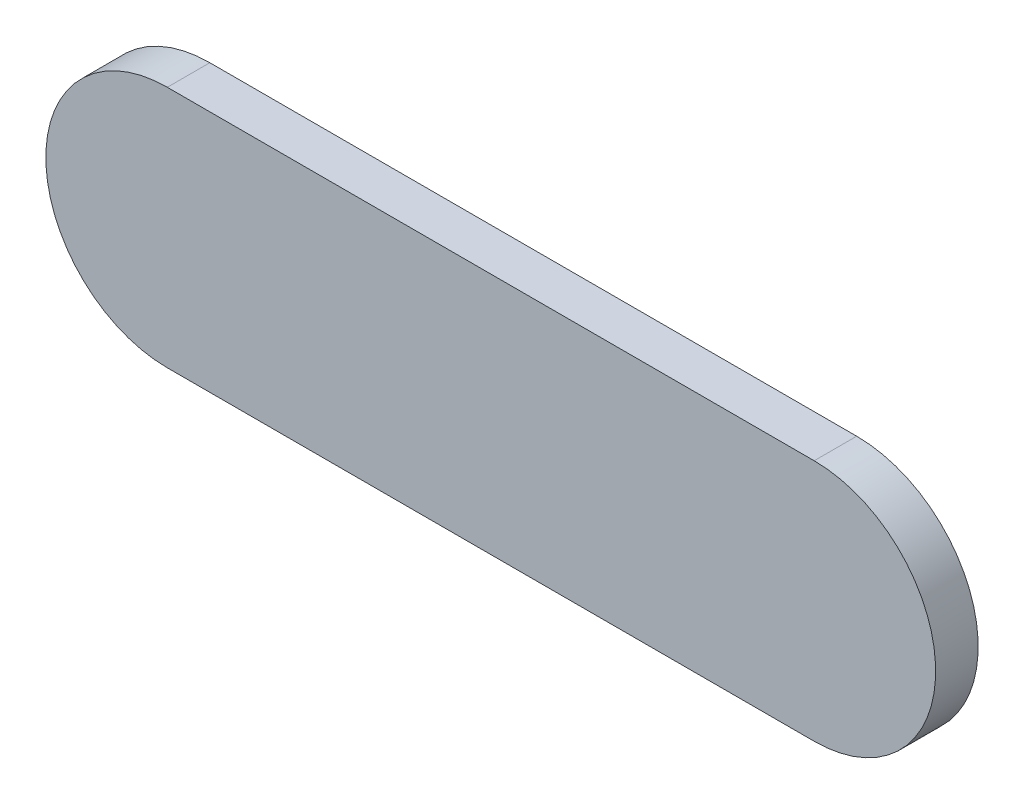
ISO-10303-21;
HEADER;
FILE_DESCRIPTION(('STEP AP214'),'2;1');
FILE_NAME('part.step','',(''),(''),'','','');
FILE_SCHEMA(('AUTOMOTIVE_DESIGN { 1 0 10303 214 1 1 1 1 }'));
ENDSEC;
DATA;
#1=APPLICATION_CONTEXT('core data for automotive mechanical design processes');
#2=APPLICATION_PROTOCOL_DEFINITION('international standard','automotive_design',2000,#1);
#3=PRODUCT_CONTEXT('',#1,'mechanical');
#4=PRODUCT('Part','Part','',(#3));
#5=PRODUCT_RELATED_PRODUCT_CATEGORY('part','',(#4));
#6=PRODUCT_DEFINITION_FORMATION('','',#4);
#7=PRODUCT_DEFINITION_CONTEXT('part definition',#1,'design');
#8=PRODUCT_DEFINITION('design','',#6,#7);
#9=PRODUCT_DEFINITION_SHAPE('','',#8);
#10=(LENGTH_UNIT() NAMED_UNIT(*) SI_UNIT(.MILLI.,.METRE.));
#11=(NAMED_UNIT(*) PLANE_ANGLE_UNIT() SI_UNIT($,.RADIAN.));
#12=(NAMED_UNIT(*) SI_UNIT($,.STERADIAN.) SOLID_ANGLE_UNIT());
#13=UNCERTAINTY_MEASURE_WITH_UNIT(LENGTH_MEASURE(1.E-05),#10,'distance_accuracy_value','');
#14=(GEOMETRIC_REPRESENTATION_CONTEXT(3) GLOBAL_UNCERTAINTY_ASSIGNED_CONTEXT((#13)) GLOBAL_UNIT_ASSIGNED_CONTEXT((#10,
#11,#12)) REPRESENTATION_CONTEXT('',''));
#15=CARTESIAN_POINT('',(0.,0.,0.));
#16=DIRECTION('',(0.,0.,1.));
#17=DIRECTION('',(1.,0.,0.));
#18=AXIS2_PLACEMENT_3D('',#15,#16,#17);
#19=CARTESIAN_POINT('',(81.5125,-111.8,1.635));
#20=DIRECTION('',(0.,0.,1.));
#21=DIRECTION('',(1.,0.,0.));
#22=AXIS2_PLACEMENT_3D('',#19,#20,#21);
#23=PLANE('',#22);
#24=DIRECTION('',(-1.,0.,0.));
#25=VECTOR('',#24,1.);
#26=CARTESIAN_POINT('',(81.5125,-111.8,1.635));
#27=LINE('',#26,#25);
#28=CARTESIAN_POINT('',(81.5125,-111.8,1.635));
#29=VERTEX_POINT('',#28);
#30=CARTESIAN_POINT('',(80.98,-111.8,1.635));
#31=VERTEX_POINT('',#30);
#32=EDGE_CURVE('E81',#29,#31,#27,.T.);
#33=ORIENTED_EDGE('',*,*,#32,.T.);
#34=CARTESIAN_POINT('',(80.98,-111.9,1.635));
#35=DIRECTION('',(0.,0.,1.));
#36=DIRECTION('',(0.,1.,0.));
#37=AXIS2_PLACEMENT_3D('',#34,#35,#36);
#38=CIRCLE('',#37,0.1);
#39=CARTESIAN_POINT('',(80.98,-112.,1.635));
#40=VERTEX_POINT('',#39);
#41=EDGE_CURVE('E106',#31,#40,#38,.T.);
#42=ORIENTED_EDGE('',*,*,#41,.T.);
#43=DIRECTION('',(1.,0.,0.));
#44=VECTOR('',#43,1.);
#45=CARTESIAN_POINT('',(80.98,-112.,1.635));
#46=LINE('',#45,#44);
#47=CARTESIAN_POINT('',(81.5125,-112.,1.635));
#48=VERTEX_POINT('',#47);
#49=EDGE_CURVE('E74',#40,#48,#46,.T.);
#50=ORIENTED_EDGE('',*,*,#49,.T.);
#51=CARTESIAN_POINT('',(81.5125,-111.9,1.635));
#52=DIRECTION('',(0.,0.,1.));
#53=DIRECTION('',(1.42108547152E-13,-1.,0.));
#54=AXIS2_PLACEMENT_3D('',#51,#52,#53);
#55=CIRCLE('',#54,0.1);
#56=EDGE_CURVE('E11',#48,#29,#55,.T.);
#57=ORIENTED_EDGE('',*,*,#56,.T.);
#58=EDGE_LOOP('',(#33,#42,#50,#57));
#59=FACE_BOUND('',#58,.T.);
#60=ADVANCED_FACE('F17',(#59),#23,.T.);
#61=CARTESIAN_POINT('',(81.5125,-111.8,1.6));
#62=DIRECTION('',(0.,0.,1.));
#63=DIRECTION('',(1.,0.,0.));
#64=AXIS2_PLACEMENT_3D('',#61,#62,#63);
#65=PLANE('',#64);
#66=CARTESIAN_POINT('',(81.5125,-111.9,1.6));
#67=DIRECTION('',(0.,0.,1.));
#68=DIRECTION('',(1.42108547152E-13,-1.,0.));
#69=AXIS2_PLACEMENT_3D('',#66,#67,#68);
#70=CIRCLE('',#69,0.1);
#71=CARTESIAN_POINT('',(81.5125,-112.,1.6));
#72=VERTEX_POINT('',#71);
#73=CARTESIAN_POINT('',(81.5125,-111.8,1.6));
#74=VERTEX_POINT('',#73);
#75=EDGE_CURVE('E25',#72,#74,#70,.T.);
#76=ORIENTED_EDGE('',*,*,#75,.F.);
#77=DIRECTION('',(1.,0.,0.));
#78=VECTOR('',#77,1.);
#79=CARTESIAN_POINT('',(80.98,-112.,1.6));
#80=LINE('',#79,#78);
#81=CARTESIAN_POINT('',(80.98,-112.,1.6));
#82=VERTEX_POINT('',#81);
#83=EDGE_CURVE('E101',#82,#72,#80,.T.);
#84=ORIENTED_EDGE('',*,*,#83,.F.);
#85=CARTESIAN_POINT('',(80.98,-111.9,1.6));
#86=DIRECTION('',(0.,0.,1.));
#87=DIRECTION('',(0.,1.,0.));
#88=AXIS2_PLACEMENT_3D('',#85,#86,#87);
#89=CIRCLE('',#88,0.1);
#90=CARTESIAN_POINT('',(80.98,-111.8,1.6));
#91=VERTEX_POINT('',#90);
#92=EDGE_CURVE('E83',#91,#82,#89,.T.);
#93=ORIENTED_EDGE('',*,*,#92,.F.);
#94=DIRECTION('',(-1.,0.,0.));
#95=VECTOR('',#94,1.);
#96=CARTESIAN_POINT('',(81.5125,-111.8,1.6));
#97=LINE('',#96,#95);
#98=EDGE_CURVE('E79',#74,#91,#97,.T.);
#99=ORIENTED_EDGE('',*,*,#98,.F.);
#100=EDGE_LOOP('',(#76,#84,#93,#99));
#101=FACE_BOUND('',#100,.T.);
#102=ADVANCED_FACE('F85',(#101),#65,.F.);
#103=CARTESIAN_POINT('',(81.5125,-111.9,1.6));
#104=DIRECTION('',(0.,0.,-1.));
#105=DIRECTION('',(1.42108547152E-13,-1.,0.));
#106=AXIS2_PLACEMENT_3D('',#103,#104,#105);
#107=CYLINDRICAL_SURFACE('',#106,0.1);
#108=ORIENTED_EDGE('',*,*,#75,.T.);
#109=DIRECTION('',(0.,0.,1.));
#110=VECTOR('',#109,1.);
#111=CARTESIAN_POINT('',(81.5125,-111.8,1.6));
#112=LINE('',#111,#110);
#113=EDGE_CURVE('E68',#74,#29,#112,.T.);
#114=ORIENTED_EDGE('',*,*,#113,.T.);
#115=ORIENTED_EDGE('',*,*,#56,.F.);
#116=DIRECTION('',(0.,0.,1.));
#117=VECTOR('',#116,1.);
#118=CARTESIAN_POINT('',(81.5125,-112.,1.6));
#119=LINE('',#118,#117);
#120=EDGE_CURVE('E71',#72,#48,#119,.T.);
#121=ORIENTED_EDGE('',*,*,#120,.F.);
#122=EDGE_LOOP('',(#108,#114,#115,#121));
#123=FACE_BOUND('',#122,.T.);
#124=ADVANCED_FACE('F67',(#123),#107,.T.);
#125=CARTESIAN_POINT('',(80.98,-112.,1.6));
#126=DIRECTION('',(0.,1.,0.));
#127=DIRECTION('',(1.,0.,0.));
#128=AXIS2_PLACEMENT_3D('',#125,#126,#127);
#129=PLANE('',#128);
#130=ORIENTED_EDGE('',*,*,#83,.T.);
#131=ORIENTED_EDGE('',*,*,#120,.T.);
#132=ORIENTED_EDGE('',*,*,#49,.F.);
#133=DIRECTION('',(0.,0.,1.));
#134=VECTOR('',#133,1.);
#135=CARTESIAN_POINT('',(80.98,-112.,1.6));
#136=LINE('',#135,#134);
#137=EDGE_CURVE('E102',#82,#40,#136,.T.);
#138=ORIENTED_EDGE('',*,*,#137,.F.);
#139=EDGE_LOOP('',(#130,#131,#132,#138));
#140=FACE_BOUND('',#139,.T.);
#141=ADVANCED_FACE('F119',(#140),#129,.F.);
#142=CARTESIAN_POINT('',(80.98,-111.9,1.6));
#143=DIRECTION('',(0.,0.,-1.));
#144=DIRECTION('',(0.,1.,0.));
#145=AXIS2_PLACEMENT_3D('',#142,#143,#144);
#146=CYLINDRICAL_SURFACE('',#145,0.1);
#147=ORIENTED_EDGE('',*,*,#92,.T.);
#148=ORIENTED_EDGE('',*,*,#137,.T.);
#149=ORIENTED_EDGE('',*,*,#41,.F.);
#150=DIRECTION('',(0.,0.,1.));
#151=VECTOR('',#150,1.);
#152=CARTESIAN_POINT('',(80.98,-111.8,1.6));
#153=LINE('',#152,#151);
#154=EDGE_CURVE('E89',#91,#31,#153,.T.);
#155=ORIENTED_EDGE('',*,*,#154,.F.);
#156=EDGE_LOOP('',(#147,#148,#149,#155));
#157=FACE_BOUND('',#156,.T.);
#158=ADVANCED_FACE('F121',(#157),#146,.T.);
#159=CARTESIAN_POINT('',(81.5125,-111.8,1.6));
#160=DIRECTION('',(0.,-1.,0.));
#161=DIRECTION('',(0.,0.,-1.));
#162=AXIS2_PLACEMENT_3D('',#159,#160,#161);
#163=PLANE('',#162);
#164=ORIENTED_EDGE('',*,*,#98,.T.);
#165=ORIENTED_EDGE('',*,*,#154,.T.);
#166=ORIENTED_EDGE('',*,*,#32,.F.);
#167=ORIENTED_EDGE('',*,*,#113,.F.);
#168=EDGE_LOOP('',(#164,#165,#166,#167));
#169=FACE_BOUND('',#168,.T.);
#170=ADVANCED_FACE('F77',(#169),#163,.F.);
#171=CLOSED_SHELL('',(#60,#102,#124,#141,#158,#170));
#172=MANIFOLD_SOLID_BREP('B1',#171);
#173=ADVANCED_BREP_SHAPE_REPRESENTATION('',(#18,#172),#14);
#174=SHAPE_DEFINITION_REPRESENTATION(#9,#173);
ENDSEC;
END-ISO-10303-21;
